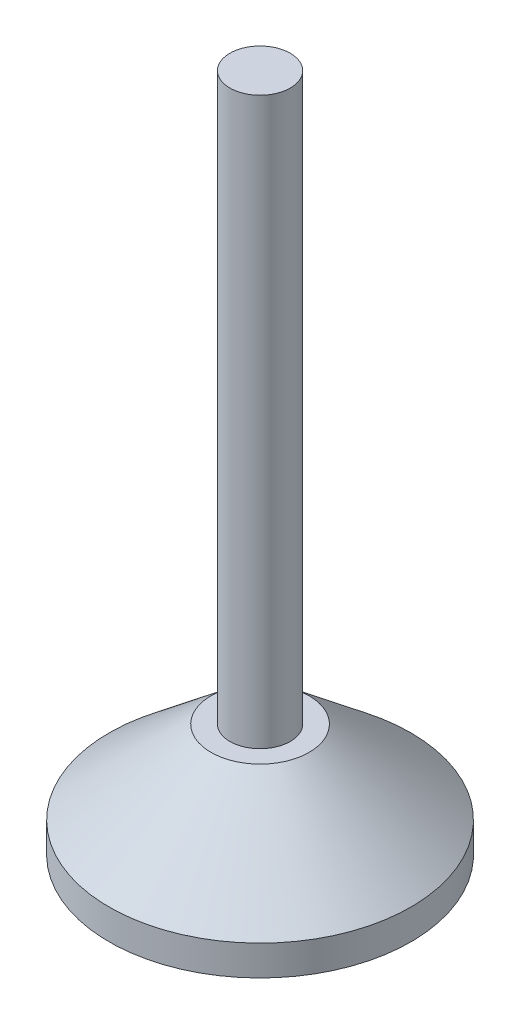
ISO-10303-21;
HEADER;
FILE_DESCRIPTION(('STEP AP214'),'2;1');
FILE_NAME('part.step','',(''),(''),'','','');
FILE_SCHEMA(('AUTOMOTIVE_DESIGN { 1 0 10303 214 1 1 1 1 }'));
ENDSEC;
DATA;
#1=APPLICATION_CONTEXT('core data for automotive mechanical design processes');
#2=APPLICATION_PROTOCOL_DEFINITION('international standard','automotive_design',2000,#1);
#3=PRODUCT_CONTEXT('',#1,'mechanical');
#4=PRODUCT('Part','Part','',(#3));
#5=PRODUCT_RELATED_PRODUCT_CATEGORY('part','',(#4));
#6=PRODUCT_DEFINITION_FORMATION('','',#4);
#7=PRODUCT_DEFINITION_CONTEXT('part definition',#1,'design');
#8=PRODUCT_DEFINITION('design','',#6,#7);
#9=PRODUCT_DEFINITION_SHAPE('','',#8);
#10=(LENGTH_UNIT() NAMED_UNIT(*) SI_UNIT(.MILLI.,.METRE.));
#11=(NAMED_UNIT(*) PLANE_ANGLE_UNIT() SI_UNIT($,.RADIAN.));
#12=(NAMED_UNIT(*) SI_UNIT($,.STERADIAN.) SOLID_ANGLE_UNIT());
#13=UNCERTAINTY_MEASURE_WITH_UNIT(LENGTH_MEASURE(1.E-05),#10,'distance_accuracy_value','');
#14=(GEOMETRIC_REPRESENTATION_CONTEXT(3) GLOBAL_UNCERTAINTY_ASSIGNED_CONTEXT((#13)) GLOBAL_UNIT_ASSIGNED_CONTEXT((#10,
#11,#12)) REPRESENTATION_CONTEXT('',''));
#15=CARTESIAN_POINT('',(0.,0.,0.));
#16=DIRECTION('',(0.,0.,1.));
#17=DIRECTION('',(1.,0.,0.));
#18=AXIS2_PLACEMENT_3D('',#15,#16,#17);
#19=CARTESIAN_POINT('',(40.,0.,0.));
#20=DIRECTION('',(0.,-1.,0.));
#21=DIRECTION('',(0.,0.,-1.));
#22=AXIS2_PLACEMENT_3D('',#19,#20,#21);
#23=PLANE('',#22);
#24=CARTESIAN_POINT('',(0.,0.,0.));
#25=DIRECTION('',(0.,-1.,0.));
#26=DIRECTION('',(0.,0.,-1.));
#27=AXIS2_PLACEMENT_3D('',#24,#25,#26);
#28=CIRCLE('',#27,40.);
#29=CARTESIAN_POINT('',(0.,0.,-40.));
#30=VERTEX_POINT('',#29);
#31=EDGE_CURVE('E60',#30,#30,#28,.T.);
#32=ORIENTED_EDGE('',*,*,#31,.T.);
#33=EDGE_LOOP('',(#32));
#34=FACE_BOUND('',#33,.T.);
#35=ADVANCED_FACE('F41',(#34),#23,.T.);
#36=CARTESIAN_POINT('',(0.,180.,0.));
#37=DIRECTION('',(0.,1.,0.));
#38=DIRECTION('',(0.,0.,1.));
#39=AXIS2_PLACEMENT_3D('',#36,#37,#38);
#40=PLANE('',#39);
#41=CARTESIAN_POINT('',(0.,180.,0.));
#42=DIRECTION('',(0.,-1.,0.));
#43=DIRECTION('',(0.,0.,-1.));
#44=AXIS2_PLACEMENT_3D('',#41,#42,#43);
#45=CIRCLE('',#44,8.);
#46=CARTESIAN_POINT('',(0.,180.,-8.));
#47=VERTEX_POINT('',#46);
#48=EDGE_CURVE('E10',#47,#47,#45,.T.);
#49=ORIENTED_EDGE('',*,*,#48,.F.);
#50=EDGE_LOOP('',(#49));
#51=FACE_BOUND('',#50,.T.);
#52=ADVANCED_FACE('F77',(#51),#40,.T.);
#53=CARTESIAN_POINT('',(0.,0.,0.));
#54=DIRECTION('',(0.,-1.,0.));
#55=DIRECTION('',(0.,0.,-1.));
#56=AXIS2_PLACEMENT_3D('',#53,#54,#55);
#57=CYLINDRICAL_SURFACE('',#56,8.00000000000001);
#58=ORIENTED_EDGE('',*,*,#48,.T.);
#59=EDGE_LOOP('',(#58));
#60=FACE_BOUND('',#59,.T.);
#61=CARTESIAN_POINT('',(0.,30.,0.));
#62=DIRECTION('',(0.,-1.,0.));
#63=DIRECTION('',(0.,0.,-1.));
#64=AXIS2_PLACEMENT_3D('',#61,#62,#63);
#65=CIRCLE('',#64,8.00000000000002);
#66=CARTESIAN_POINT('',(0.,30.,-8.00000000000002));
#67=VERTEX_POINT('',#66);
#68=EDGE_CURVE('E47',#67,#67,#65,.T.);
#69=ORIENTED_EDGE('',*,*,#68,.F.);
#70=EDGE_LOOP('',(#69));
#71=FACE_BOUND('',#70,.T.);
#72=ADVANCED_FACE('F81',(#60,#71),#57,.T.);
#73=CARTESIAN_POINT('',(8.00000000000002,30.,0.));
#74=DIRECTION('',(0.,1.,0.));
#75=DIRECTION('',(0.,0.,1.));
#76=AXIS2_PLACEMENT_3D('',#73,#74,#75);
#77=PLANE('',#76);
#78=ORIENTED_EDGE('',*,*,#68,.T.);
#79=EDGE_LOOP('',(#78));
#80=FACE_BOUND('',#79,.T.);
#81=CARTESIAN_POINT('',(0.,30.,0.));
#82=DIRECTION('',(0.,-1.,0.));
#83=DIRECTION('',(0.,0.,-1.));
#84=AXIS2_PLACEMENT_3D('',#81,#82,#83);
#85=CIRCLE('',#84,13.);
#86=CARTESIAN_POINT('',(0.,30.,-13.));
#87=VERTEX_POINT('',#86);
#88=EDGE_CURVE('E51',#87,#87,#85,.T.);
#89=ORIENTED_EDGE('',*,*,#88,.F.);
#90=EDGE_LOOP('',(#89));
#91=FACE_BOUND('',#90,.T.);
#92=ADVANCED_FACE('F73',(#80,#91),#77,.T.);
#93=CARTESIAN_POINT('',(0.,8.,0.));
#94=DIRECTION('',(0.,-1.,0.));
#95=DIRECTION('',(0.,0.,-1.));
#96=AXIS2_PLACEMENT_3D('',#93,#94,#95);
#97=CONICAL_SURFACE('',#96,40.,0.887087015160525);
#98=CARTESIAN_POINT('',(0.,8.,0.));
#99=DIRECTION('',(0.,-1.,0.));
#100=DIRECTION('',(0.,0.,-1.));
#101=AXIS2_PLACEMENT_3D('',#98,#99,#100);
#102=CIRCLE('',#101,40.);
#103=CARTESIAN_POINT('',(0.,8.,-40.));
#104=VERTEX_POINT('',#103);
#105=EDGE_CURVE('E55',#104,#104,#102,.T.);
#106=CARTESIAN_POINT('',(0.,30.,-13.));
#107=CARTESIAN_POINT('',(0.,29.7708333333333,-13.28125));
#108=CARTESIAN_POINT('',(0.,29.5416666666667,-13.5625));
#109=CARTESIAN_POINT('',(0.,29.0833333333333,-14.125));
#110=CARTESIAN_POINT('',(0.,28.8541666666667,-14.40625));
#111=CARTESIAN_POINT('',(0.,28.3958333333333,-14.96875));
#112=CARTESIAN_POINT('',(0.,28.1666666666667,-15.25));
#113=CARTESIAN_POINT('',(0.,27.7083333333333,-15.8125));
#114=CARTESIAN_POINT('',(0.,27.4791666666667,-16.09375));
#115=CARTESIAN_POINT('',(0.,27.0208333333333,-16.65625));
#116=CARTESIAN_POINT('',(0.,26.7916666666667,-16.9375));
#117=CARTESIAN_POINT('',(0.,26.3333333333333,-17.5));
#118=CARTESIAN_POINT('',(0.,26.1041666666667,-17.78125));
#119=CARTESIAN_POINT('',(0.,25.6458333333333,-18.34375));
#120=CARTESIAN_POINT('',(0.,25.4166666666667,-18.625));
#121=CARTESIAN_POINT('',(0.,24.9583333333333,-19.1875));
#122=CARTESIAN_POINT('',(0.,24.7291666666667,-19.46875));
#123=CARTESIAN_POINT('',(0.,24.2708333333333,-20.03125));
#124=CARTESIAN_POINT('',(0.,24.0416666666667,-20.3125));
#125=CARTESIAN_POINT('',(0.,23.5833333333333,-20.875));
#126=CARTESIAN_POINT('',(0.,23.3541666666667,-21.15625));
#127=CARTESIAN_POINT('',(0.,22.8958333333333,-21.71875));
#128=CARTESIAN_POINT('',(0.,22.6666666666667,-22.));
#129=CARTESIAN_POINT('',(0.,22.2083333333333,-22.5625));
#130=CARTESIAN_POINT('',(0.,21.9791666666667,-22.84375));
#131=CARTESIAN_POINT('',(0.,21.5208333333333,-23.40625));
#132=CARTESIAN_POINT('',(0.,21.2916666666667,-23.6875));
#133=CARTESIAN_POINT('',(0.,20.8333333333333,-24.25));
#134=CARTESIAN_POINT('',(0.,20.6041666666667,-24.53125));
#135=CARTESIAN_POINT('',(0.,20.1458333333333,-25.09375));
#136=CARTESIAN_POINT('',(0.,19.9166666666667,-25.375));
#137=CARTESIAN_POINT('',(0.,19.4583333333333,-25.9375));
#138=CARTESIAN_POINT('',(0.,19.2291666666667,-26.21875));
#139=CARTESIAN_POINT('',(0.,18.7708333333333,-26.78125));
#140=CARTESIAN_POINT('',(0.,18.5416666666667,-27.0625));
#141=CARTESIAN_POINT('',(0.,18.0833333333333,-27.625));
#142=CARTESIAN_POINT('',(0.,17.8541666666667,-27.90625));
#143=CARTESIAN_POINT('',(0.,17.3958333333333,-28.46875));
#144=CARTESIAN_POINT('',(0.,17.1666666666667,-28.75));
#145=CARTESIAN_POINT('',(0.,16.7083333333333,-29.3125));
#146=CARTESIAN_POINT('',(0.,16.4791666666667,-29.59375));
#147=CARTESIAN_POINT('',(0.,16.0208333333333,-30.15625));
#148=CARTESIAN_POINT('',(0.,15.7916666666667,-30.4375));
#149=CARTESIAN_POINT('',(0.,15.3333333333333,-31.));
#150=CARTESIAN_POINT('',(0.,15.1041666666667,-31.28125));
#151=CARTESIAN_POINT('',(0.,14.6458333333333,-31.84375));
#152=CARTESIAN_POINT('',(0.,14.4166666666667,-32.125));
#153=CARTESIAN_POINT('',(0.,13.9583333333333,-32.6875));
#154=CARTESIAN_POINT('',(0.,13.7291666666667,-32.96875));
#155=CARTESIAN_POINT('',(0.,13.2708333333333,-33.53125));
#156=CARTESIAN_POINT('',(0.,13.0416666666667,-33.8125));
#157=CARTESIAN_POINT('',(0.,12.5833333333333,-34.375));
#158=CARTESIAN_POINT('',(0.,12.3541666666667,-34.65625));
#159=CARTESIAN_POINT('',(0.,11.8958333333333,-35.21875));
#160=CARTESIAN_POINT('',(0.,11.6666666666667,-35.5));
#161=CARTESIAN_POINT('',(0.,11.2083333333333,-36.0625));
#162=CARTESIAN_POINT('',(0.,10.9791666666667,-36.34375));
#163=CARTESIAN_POINT('',(0.,10.5208333333333,-36.90625));
#164=CARTESIAN_POINT('',(0.,10.2916666666667,-37.1875));
#165=CARTESIAN_POINT('',(0.,9.83333333333333,-37.75));
#166=CARTESIAN_POINT('',(0.,9.60416666666667,-38.03125));
#167=CARTESIAN_POINT('',(0.,9.14583333333333,-38.59375));
#168=CARTESIAN_POINT('',(0.,8.91666666666667,-38.875));
#169=CARTESIAN_POINT('',(0.,8.45833333333334,-39.4375));
#170=CARTESIAN_POINT('',(0.,8.22916666666667,-39.71875));
#171=CARTESIAN_POINT('',(0.,8.,-40.));
#172=B_SPLINE_CURVE_WITH_KNOTS('',3,(#106,#107,#108,#109,#110,#111,#112,#113,#114,#115,#116,
#117,#118,#119,#120,#121,#122,#123,#124,#125,#126,#127,#128,#129,#130,#131,#132,#133,#134,#135,
#136,#137,#138,#139,#140,#141,#142,#143,#144,#145,#146,#147,#148,#149,#150,#151,#152,#153,#154,
#155,#156,#157,#158,#159,#160,#161,#162,#163,#164,#165,#166,#167,#168,#169,#170,#171),
.UNSPECIFIED.,.F.,.F.,(4,2,2,2,2,2,2,2,2,2,2,2,2,2,2,2,2,2,2,2,2,2,2,2,2,2,2,2,2,2,2,2,4),(0.,
1.08837967295425,2.1767593459085,3.26513901886275,4.353518691817,5.44189836477125,
6.5302780377255,7.61865771067975,8.707037383634,9.79541705658825,10.8837967295425,
11.9721764024967,13.060556075451,14.1489357484052,15.2373154213595,16.3256950943137,
17.414074767268,18.5024544402222,19.5908341131765,20.6792137861307,21.767593459085,
22.8559731320392,23.9443528049935,25.0327324779477,26.121112150902,27.2094918238562,
28.2978714968105,29.3862511697647,30.474630842719,31.5630105156732,32.6513901886275,
33.7397698615818,34.828149534536),.UNSPECIFIED.);
#173=EDGE_CURVE('BSEAM67',#87,#104,#172,.T.);
#174=ORIENTED_EDGE('',*,*,#88,.T.);
#175=ORIENTED_EDGE('',*,*,#105,.F.);
#176=ORIENTED_EDGE('',*,*,#173,.T.);
#177=ORIENTED_EDGE('',*,*,#173,.F.);
#178=EDGE_LOOP('',(#174,#176,#175,#177));
#179=FACE_BOUND('',#178,.T.);
#180=ADVANCED_FACE('F67',(#179),#97,.T.);
#181=CARTESIAN_POINT('',(0.,0.,0.));
#182=DIRECTION('',(0.,-1.,0.));
#183=DIRECTION('',(0.,0.,-1.));
#184=AXIS2_PLACEMENT_3D('',#181,#182,#183);
#185=CYLINDRICAL_SURFACE('',#184,40.);
#186=ORIENTED_EDGE('',*,*,#105,.T.);
#187=EDGE_LOOP('',(#186));
#188=FACE_BOUND('',#187,.T.);
#189=ORIENTED_EDGE('',*,*,#31,.F.);
#190=EDGE_LOOP('',(#189));
#191=FACE_BOUND('',#190,.T.);
#192=ADVANCED_FACE('F65',(#188,#191),#185,.T.);
#193=CLOSED_SHELL('',(#35,#52,#72,#92,#180,#192));
#194=MANIFOLD_SOLID_BREP('B2',#193);
#195=ADVANCED_BREP_SHAPE_REPRESENTATION('',(#18,#194),#14);
#196=SHAPE_DEFINITION_REPRESENTATION(#9,#195);
ENDSEC;
END-ISO-10303-21;
